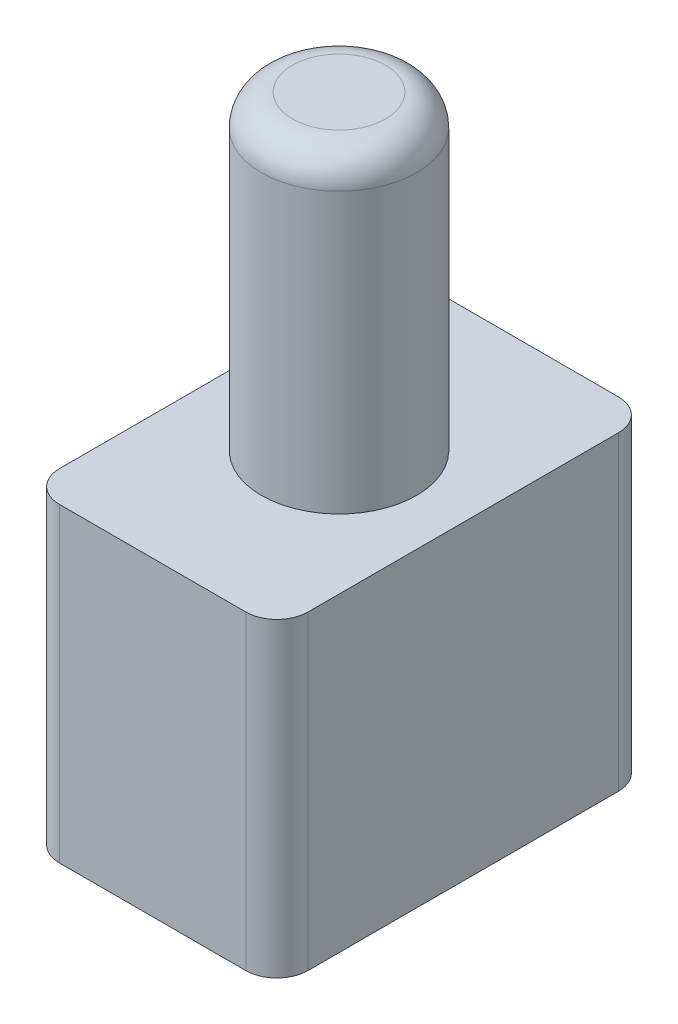
ISO-10303-21;
HEADER;
FILE_DESCRIPTION(('STEP AP214'),'2;1');
FILE_NAME('part.step','',(''),(''),'','','');
FILE_SCHEMA(('AUTOMOTIVE_DESIGN { 1 0 10303 214 1 1 1 1 }'));
ENDSEC;
DATA;
#1=APPLICATION_CONTEXT('core data for automotive mechanical design processes');
#2=APPLICATION_PROTOCOL_DEFINITION('international standard','automotive_design',2000,#1);
#3=PRODUCT_CONTEXT('',#1,'mechanical');
#4=PRODUCT('Part','Part','',(#3));
#5=PRODUCT_RELATED_PRODUCT_CATEGORY('part','',(#4));
#6=PRODUCT_DEFINITION_FORMATION('','',#4);
#7=PRODUCT_DEFINITION_CONTEXT('part definition',#1,'design');
#8=PRODUCT_DEFINITION('design','',#6,#7);
#9=PRODUCT_DEFINITION_SHAPE('','',#8);
#10=(LENGTH_UNIT() NAMED_UNIT(*) SI_UNIT(.MILLI.,.METRE.));
#11=(NAMED_UNIT(*) PLANE_ANGLE_UNIT() SI_UNIT($,.RADIAN.));
#12=(NAMED_UNIT(*) SI_UNIT($,.STERADIAN.) SOLID_ANGLE_UNIT());
#13=UNCERTAINTY_MEASURE_WITH_UNIT(LENGTH_MEASURE(1.E-05),#10,'distance_accuracy_value','');
#14=(GEOMETRIC_REPRESENTATION_CONTEXT(3) GLOBAL_UNCERTAINTY_ASSIGNED_CONTEXT((#13)) GLOBAL_UNIT_ASSIGNED_CONTEXT((#10,
#11,#12)) REPRESENTATION_CONTEXT('',''));
#15=CARTESIAN_POINT('',(0.,0.,0.));
#16=DIRECTION('',(0.,0.,1.));
#17=DIRECTION('',(1.,0.,0.));
#18=AXIS2_PLACEMENT_3D('',#15,#16,#17);
#19=CARTESIAN_POINT('',(0.,10.,0.));
#20=DIRECTION('',(1.,0.,0.));
#21=DIRECTION('',(0.,0.,-1.));
#22=AXIS2_PLACEMENT_3D('',#19,#20,#21);
#23=PLANE('',#22);
#24=DIRECTION('',(0.,0.,1.));
#25=VECTOR('',#24,1.);
#26=CARTESIAN_POINT('',(0.,10.,0.));
#27=LINE('',#26,#25);
#28=CARTESIAN_POINT('',(0.,10.,-11.));
#29=VERTEX_POINT('',#28);
#30=CARTESIAN_POINT('',(0.,10.,-1.));
#31=VERTEX_POINT('',#30);
#32=EDGE_CURVE('E138',#29,#31,#27,.T.);
#33=ORIENTED_EDGE('',*,*,#32,.F.);
#34=DIRECTION('',(0.,-1.,0.));
#35=VECTOR('',#34,1.);
#36=CARTESIAN_POINT('',(0.,10.,-11.));
#37=LINE('',#36,#35);
#38=CARTESIAN_POINT('',(0.,0.,-11.));
#39=VERTEX_POINT('',#38);
#40=EDGE_CURVE('E186',#29,#39,#37,.T.);
#41=ORIENTED_EDGE('',*,*,#40,.T.);
#42=DIRECTION('',(0.,0.,1.));
#43=VECTOR('',#42,1.);
#44=CARTESIAN_POINT('',(0.,0.,0.));
#45=LINE('',#44,#43);
#46=CARTESIAN_POINT('',(0.,0.,-1.));
#47=VERTEX_POINT('',#46);
#48=EDGE_CURVE('E197',#39,#47,#45,.T.);
#49=ORIENTED_EDGE('',*,*,#48,.T.);
#50=DIRECTION('',(0.,-1.,0.));
#51=VECTOR('',#50,1.);
#52=CARTESIAN_POINT('',(0.,10.,-1.));
#53=LINE('',#52,#51);
#54=EDGE_CURVE('E183',#47,#31,#53,.F.);
#55=ORIENTED_EDGE('',*,*,#54,.T.);
#56=EDGE_LOOP('',(#33,#41,#49,#55));
#57=FACE_BOUND('',#56,.T.);
#58=ADVANCED_FACE('F43',(#57),#23,.F.);
#59=CARTESIAN_POINT('',(0.,10.,0.));
#60=DIRECTION('',(0.,0.,-1.));
#61=DIRECTION('',(-1.,0.,0.));
#62=AXIS2_PLACEMENT_3D('',#59,#60,#61);
#63=PLANE('',#62);
#64=DIRECTION('',(1.,0.,0.));
#65=VECTOR('',#64,1.);
#66=CARTESIAN_POINT('',(0.,0.,0.));
#67=LINE('',#66,#65);
#68=CARTESIAN_POINT('',(1.,0.,0.));
#69=VERTEX_POINT('',#68);
#70=CARTESIAN_POINT('',(7.,0.,0.));
#71=VERTEX_POINT('',#70);
#72=EDGE_CURVE('E145',#69,#71,#67,.T.);
#73=ORIENTED_EDGE('',*,*,#72,.T.);
#74=DIRECTION('',(0.,-1.,0.));
#75=VECTOR('',#74,1.);
#76=CARTESIAN_POINT('',(7.,10.,0.));
#77=LINE('',#76,#75);
#78=CARTESIAN_POINT('',(7.,10.,0.));
#79=VERTEX_POINT('',#78);
#80=EDGE_CURVE('E11',#71,#79,#77,.F.);
#81=ORIENTED_EDGE('',*,*,#80,.T.);
#82=DIRECTION('',(1.,0.,0.));
#83=VECTOR('',#82,1.);
#84=CARTESIAN_POINT('',(0.,10.,0.));
#85=LINE('',#84,#83);
#86=CARTESIAN_POINT('',(1.,10.,0.));
#87=VERTEX_POINT('',#86);
#88=EDGE_CURVE('E143',#87,#79,#85,.T.);
#89=ORIENTED_EDGE('',*,*,#88,.F.);
#90=DIRECTION('',(0.,-1.,0.));
#91=VECTOR('',#90,1.);
#92=CARTESIAN_POINT('',(1.,10.,0.));
#93=LINE('',#92,#91);
#94=EDGE_CURVE('E52',#87,#69,#93,.T.);
#95=ORIENTED_EDGE('',*,*,#94,.T.);
#96=EDGE_LOOP('',(#73,#81,#89,#95));
#97=FACE_BOUND('',#96,.T.);
#98=ADVANCED_FACE('F193',(#97),#63,.F.);
#99=CARTESIAN_POINT('',(8.,10.,0.));
#100=DIRECTION('',(-1.,0.,0.));
#101=DIRECTION('',(0.,0.,1.));
#102=AXIS2_PLACEMENT_3D('',#99,#100,#101);
#103=PLANE('',#102);
#104=DIRECTION('',(0.,0.,-1.));
#105=VECTOR('',#104,1.);
#106=CARTESIAN_POINT('',(8.,0.,0.));
#107=LINE('',#106,#105);
#108=CARTESIAN_POINT('',(8.,0.,-1.));
#109=VERTEX_POINT('',#108);
#110=CARTESIAN_POINT('',(8.,0.,-11.));
#111=VERTEX_POINT('',#110);
#112=EDGE_CURVE('E139',#109,#111,#107,.T.);
#113=ORIENTED_EDGE('',*,*,#112,.T.);
#114=DIRECTION('',(0.,-1.,0.));
#115=VECTOR('',#114,1.);
#116=CARTESIAN_POINT('',(8.,10.,-11.));
#117=LINE('',#116,#115);
#118=CARTESIAN_POINT('',(8.,10.,-11.));
#119=VERTEX_POINT('',#118);
#120=EDGE_CURVE('E114',#111,#119,#117,.F.);
#121=ORIENTED_EDGE('',*,*,#120,.T.);
#122=DIRECTION('',(0.,0.,-1.));
#123=VECTOR('',#122,1.);
#124=CARTESIAN_POINT('',(8.,10.,0.));
#125=LINE('',#124,#123);
#126=CARTESIAN_POINT('',(8.,10.,-1.));
#127=VERTEX_POINT('',#126);
#128=EDGE_CURVE('E203',#127,#119,#125,.T.);
#129=ORIENTED_EDGE('',*,*,#128,.F.);
#130=DIRECTION('',(0.,-1.,0.));
#131=VECTOR('',#130,1.);
#132=CARTESIAN_POINT('',(8.,10.,-1.));
#133=LINE('',#132,#131);
#134=EDGE_CURVE('E120',#127,#109,#133,.T.);
#135=ORIENTED_EDGE('',*,*,#134,.T.);
#136=EDGE_LOOP('',(#113,#121,#129,#135));
#137=FACE_BOUND('',#136,.T.);
#138=ADVANCED_FACE('F222',(#137),#103,.F.);
#139=CARTESIAN_POINT('',(0.,10.,-12.));
#140=DIRECTION('',(0.,0.,1.));
#141=DIRECTION('',(1.,0.,0.));
#142=AXIS2_PLACEMENT_3D('',#139,#140,#141);
#143=PLANE('',#142);
#144=DIRECTION('',(-1.,0.,0.));
#145=VECTOR('',#144,1.);
#146=CARTESIAN_POINT('',(0.,10.,-12.));
#147=LINE('',#146,#145);
#148=CARTESIAN_POINT('',(7.,10.,-12.));
#149=VERTEX_POINT('',#148);
#150=CARTESIAN_POINT('',(1.,10.,-12.));
#151=VERTEX_POINT('',#150);
#152=EDGE_CURVE('E130',#149,#151,#147,.T.);
#153=ORIENTED_EDGE('',*,*,#152,.F.);
#154=DIRECTION('',(0.,-1.,0.));
#155=VECTOR('',#154,1.);
#156=CARTESIAN_POINT('',(7.,10.,-12.));
#157=LINE('',#156,#155);
#158=CARTESIAN_POINT('',(7.,0.,-12.));
#159=VERTEX_POINT('',#158);
#160=EDGE_CURVE('E113',#149,#159,#157,.T.);
#161=ORIENTED_EDGE('',*,*,#160,.T.);
#162=DIRECTION('',(-1.,0.,0.));
#163=VECTOR('',#162,1.);
#164=CARTESIAN_POINT('',(0.,0.,-12.));
#165=LINE('',#164,#163);
#166=CARTESIAN_POINT('',(1.,0.,-12.));
#167=VERTEX_POINT('',#166);
#168=EDGE_CURVE('E127',#159,#167,#165,.T.);
#169=ORIENTED_EDGE('',*,*,#168,.T.);
#170=DIRECTION('',(0.,-1.,0.));
#171=VECTOR('',#170,1.);
#172=CARTESIAN_POINT('',(1.,10.,-12.));
#173=LINE('',#172,#171);
#174=EDGE_CURVE('E133',#167,#151,#173,.F.);
#175=ORIENTED_EDGE('',*,*,#174,.T.);
#176=EDGE_LOOP('',(#153,#161,#169,#175));
#177=FACE_BOUND('',#176,.T.);
#178=ADVANCED_FACE('F126',(#177),#143,.F.);
#179=CARTESIAN_POINT('',(0.,10.,0.));
#180=DIRECTION('',(0.,-1.,0.));
#181=DIRECTION('',(0.,0.,-1.));
#182=AXIS2_PLACEMENT_3D('',#179,#180,#181);
#183=PLANE('',#182);
#184=CARTESIAN_POINT('',(4.,10.,-6.));
#185=DIRECTION('',(0.,1.,0.));
#186=DIRECTION('',(0.,0.,1.));
#187=AXIS2_PLACEMENT_3D('',#184,#185,#186);
#188=CIRCLE('',#187,2.5);
#189=CARTESIAN_POINT('',(4.,10.,-3.5));
#190=VERTEX_POINT('',#189);
#191=EDGE_CURVE('E154',#190,#190,#188,.T.);
#192=ORIENTED_EDGE('',*,*,#191,.F.);
#193=EDGE_LOOP('',(#192));
#194=FACE_BOUND('',#193,.T.);
#195=ORIENTED_EDGE('',*,*,#128,.T.);
#196=CARTESIAN_POINT('',(7.,10.,-11.));
#197=DIRECTION('',(0.,-1.,0.));
#198=DIRECTION('',(0.,0.,-1.));
#199=AXIS2_PLACEMENT_3D('',#196,#197,#198);
#200=CIRCLE('',#199,1.);
#201=EDGE_CURVE('E180',#119,#149,#200,.F.);
#202=ORIENTED_EDGE('',*,*,#201,.T.);
#203=ORIENTED_EDGE('',*,*,#152,.T.);
#204=CARTESIAN_POINT('',(1.,10.,-11.));
#205=DIRECTION('',(0.,-1.,0.));
#206=DIRECTION('',(0.,0.,-1.));
#207=AXIS2_PLACEMENT_3D('',#204,#205,#206);
#208=CIRCLE('',#207,1.);
#209=EDGE_CURVE('E177',#151,#29,#208,.F.);
#210=ORIENTED_EDGE('',*,*,#209,.T.);
#211=ORIENTED_EDGE('',*,*,#32,.T.);
#212=CARTESIAN_POINT('',(1.,10.,-1.));
#213=DIRECTION('',(0.,-1.,0.));
#214=DIRECTION('',(0.,0.,-1.));
#215=AXIS2_PLACEMENT_3D('',#212,#213,#214);
#216=CIRCLE('',#215,1.);
#217=EDGE_CURVE('E64',#31,#87,#216,.F.);
#218=ORIENTED_EDGE('',*,*,#217,.T.);
#219=ORIENTED_EDGE('',*,*,#88,.T.);
#220=CARTESIAN_POINT('',(7.,10.,-1.));
#221=DIRECTION('',(0.,-1.,0.));
#222=DIRECTION('',(0.,0.,-1.));
#223=AXIS2_PLACEMENT_3D('',#220,#221,#222);
#224=CIRCLE('',#223,1.);
#225=EDGE_CURVE('E174',#79,#127,#224,.F.);
#226=ORIENTED_EDGE('',*,*,#225,.T.);
#227=EDGE_LOOP('',(#195,#202,#203,#210,#211,#218,#219,#226));
#228=FACE_BOUND('',#227,.T.);
#229=ADVANCED_FACE('F215',(#194,#228),#183,.F.);
#230=CARTESIAN_POINT('',(0.,0.,0.));
#231=DIRECTION('',(0.,-1.,0.));
#232=DIRECTION('',(0.,0.,-1.));
#233=AXIS2_PLACEMENT_3D('',#230,#231,#232);
#234=PLANE('',#233);
#235=ORIENTED_EDGE('',*,*,#168,.F.);
#236=CARTESIAN_POINT('',(7.,0.,-11.));
#237=DIRECTION('',(0.,-1.,0.));
#238=DIRECTION('',(0.,0.,-1.));
#239=AXIS2_PLACEMENT_3D('',#236,#237,#238);
#240=CIRCLE('',#239,1.);
#241=EDGE_CURVE('E109',#159,#111,#240,.T.);
#242=ORIENTED_EDGE('',*,*,#241,.T.);
#243=ORIENTED_EDGE('',*,*,#112,.F.);
#244=CARTESIAN_POINT('',(7.,0.,-1.));
#245=DIRECTION('',(0.,-1.,0.));
#246=DIRECTION('',(0.,0.,-1.));
#247=AXIS2_PLACEMENT_3D('',#244,#245,#246);
#248=CIRCLE('',#247,1.);
#249=EDGE_CURVE('E162',#109,#71,#248,.T.);
#250=ORIENTED_EDGE('',*,*,#249,.T.);
#251=ORIENTED_EDGE('',*,*,#72,.F.);
#252=CARTESIAN_POINT('',(1.,0.,-1.));
#253=DIRECTION('',(0.,-1.,0.));
#254=DIRECTION('',(0.,0.,-1.));
#255=AXIS2_PLACEMENT_3D('',#252,#253,#254);
#256=CIRCLE('',#255,1.);
#257=EDGE_CURVE('E132',#69,#47,#256,.T.);
#258=ORIENTED_EDGE('',*,*,#257,.T.);
#259=ORIENTED_EDGE('',*,*,#48,.F.);
#260=CARTESIAN_POINT('',(1.,0.,-11.));
#261=DIRECTION('',(0.,-1.,0.));
#262=DIRECTION('',(0.,0.,-1.));
#263=AXIS2_PLACEMENT_3D('',#260,#261,#262);
#264=CIRCLE('',#263,1.);
#265=EDGE_CURVE('E121',#39,#167,#264,.T.);
#266=ORIENTED_EDGE('',*,*,#265,.T.);
#267=EDGE_LOOP('',(#235,#242,#243,#250,#251,#258,#259,#266));
#268=FACE_BOUND('',#267,.T.);
#269=ADVANCED_FACE('F135',(#268),#234,.T.);
#270=CARTESIAN_POINT('',(4.,20.,-6.));
#271=DIRECTION('',(0.,-1.,0.));
#272=DIRECTION('',(0.,0.,-1.));
#273=AXIS2_PLACEMENT_3D('',#270,#271,#272);
#274=CYLINDRICAL_SURFACE('',#273,2.5);
#275=CARTESIAN_POINT('',(4.,19.,-6.));
#276=DIRECTION('',(0.,1.,0.));
#277=DIRECTION('',(0.,0.,1.));
#278=AXIS2_PLACEMENT_3D('',#275,#276,#277);
#279=CIRCLE('',#278,2.5);
#280=CARTESIAN_POINT('',(4.,19.,-3.5));
#281=VERTEX_POINT('',#280);
#282=EDGE_CURVE('E153',#281,#281,#279,.F.);
#283=ORIENTED_EDGE('',*,*,#282,.T.);
#284=EDGE_LOOP('',(#283));
#285=FACE_BOUND('',#284,.T.);
#286=ORIENTED_EDGE('',*,*,#191,.T.);
#287=EDGE_LOOP('',(#286));
#288=FACE_BOUND('',#287,.T.);
#289=ADVANCED_FACE('F213',(#285,#288),#274,.T.);
#290=CARTESIAN_POINT('',(4.,20.,-6.));
#291=DIRECTION('',(0.,1.,0.));
#292=DIRECTION('',(0.,0.,1.));
#293=AXIS2_PLACEMENT_3D('',#290,#291,#292);
#294=PLANE('',#293);
#295=CARTESIAN_POINT('',(4.,20.,-6.));
#296=DIRECTION('',(0.,1.,0.));
#297=DIRECTION('',(0.,0.,1.));
#298=AXIS2_PLACEMENT_3D('',#295,#296,#297);
#299=CIRCLE('',#298,1.5);
#300=CARTESIAN_POINT('',(4.,20.,-4.5));
#301=VERTEX_POINT('',#300);
#302=EDGE_CURVE('E149',#301,#301,#299,.T.);
#303=ORIENTED_EDGE('',*,*,#302,.T.);
#304=EDGE_LOOP('',(#303));
#305=FACE_BOUND('',#304,.T.);
#306=ADVANCED_FACE('F246',(#305),#294,.T.);
#307=CARTESIAN_POINT('',(4.,19.,-6.));
#308=DIRECTION('',(0.,1.,0.));
#309=DIRECTION('',(0.,0.,1.));
#310=AXIS2_PLACEMENT_3D('',#307,#308,#309);
#311=TOROIDAL_SURFACE('',#310,1.5,1.);
#312=ORIENTED_EDGE('',*,*,#282,.F.);
#313=EDGE_LOOP('',(#312));
#314=FACE_BOUND('',#313,.T.);
#315=ORIENTED_EDGE('',*,*,#302,.F.);
#316=EDGE_LOOP('',(#315));
#317=FACE_BOUND('',#316,.T.);
#318=ADVANCED_FACE('F243',(#314,#317),#311,.T.);
#319=CARTESIAN_POINT('',(7.,10.,-11.));
#320=DIRECTION('',(0.,-1.,0.));
#321=DIRECTION('',(0.,0.,-1.));
#322=AXIS2_PLACEMENT_3D('',#319,#320,#321);
#323=CYLINDRICAL_SURFACE('',#322,1.);
#324=ORIENTED_EDGE('',*,*,#201,.F.);
#325=ORIENTED_EDGE('',*,*,#120,.F.);
#326=ORIENTED_EDGE('',*,*,#241,.F.);
#327=ORIENTED_EDGE('',*,*,#160,.F.);
#328=EDGE_LOOP('',(#324,#325,#326,#327));
#329=FACE_BOUND('',#328,.T.);
#330=ADVANCED_FACE('F112',(#329),#323,.T.);
#331=CARTESIAN_POINT('',(1.,10.,-11.));
#332=DIRECTION('',(0.,-1.,0.));
#333=DIRECTION('',(0.,0.,-1.));
#334=AXIS2_PLACEMENT_3D('',#331,#332,#333);
#335=CYLINDRICAL_SURFACE('',#334,1.);
#336=ORIENTED_EDGE('',*,*,#209,.F.);
#337=ORIENTED_EDGE('',*,*,#174,.F.);
#338=ORIENTED_EDGE('',*,*,#265,.F.);
#339=ORIENTED_EDGE('',*,*,#40,.F.);
#340=EDGE_LOOP('',(#336,#337,#338,#339));
#341=FACE_BOUND('',#340,.T.);
#342=ADVANCED_FACE('F226',(#341),#335,.T.);
#343=CARTESIAN_POINT('',(7.,10.,-1.));
#344=DIRECTION('',(0.,-1.,0.));
#345=DIRECTION('',(0.,0.,-1.));
#346=AXIS2_PLACEMENT_3D('',#343,#344,#345);
#347=CYLINDRICAL_SURFACE('',#346,1.);
#348=ORIENTED_EDGE('',*,*,#225,.F.);
#349=ORIENTED_EDGE('',*,*,#80,.F.);
#350=ORIENTED_EDGE('',*,*,#249,.F.);
#351=ORIENTED_EDGE('',*,*,#134,.F.);
#352=EDGE_LOOP('',(#348,#349,#350,#351));
#353=FACE_BOUND('',#352,.T.);
#354=ADVANCED_FACE('F224',(#353),#347,.T.);
#355=CARTESIAN_POINT('',(1.,10.,-1.));
#356=DIRECTION('',(0.,-1.,0.));
#357=DIRECTION('',(0.,0.,-1.));
#358=AXIS2_PLACEMENT_3D('',#355,#356,#357);
#359=CYLINDRICAL_SURFACE('',#358,1.);
#360=ORIENTED_EDGE('',*,*,#217,.F.);
#361=ORIENTED_EDGE('',*,*,#54,.F.);
#362=ORIENTED_EDGE('',*,*,#257,.F.);
#363=ORIENTED_EDGE('',*,*,#94,.F.);
#364=EDGE_LOOP('',(#360,#361,#362,#363));
#365=FACE_BOUND('',#364,.T.);
#366=ADVANCED_FACE('F45',(#365),#359,.T.);
#367=CLOSED_SHELL('',(#58,#98,#138,#178,#229,#269,#289,#306,#318,#330,#342,#354,#366));
#368=MANIFOLD_SOLID_BREP('B2',#367);
#369=ADVANCED_BREP_SHAPE_REPRESENTATION('',(#18,#368),#14);
#370=SHAPE_DEFINITION_REPRESENTATION(#9,#369);
ENDSEC;
END-ISO-10303-21;
